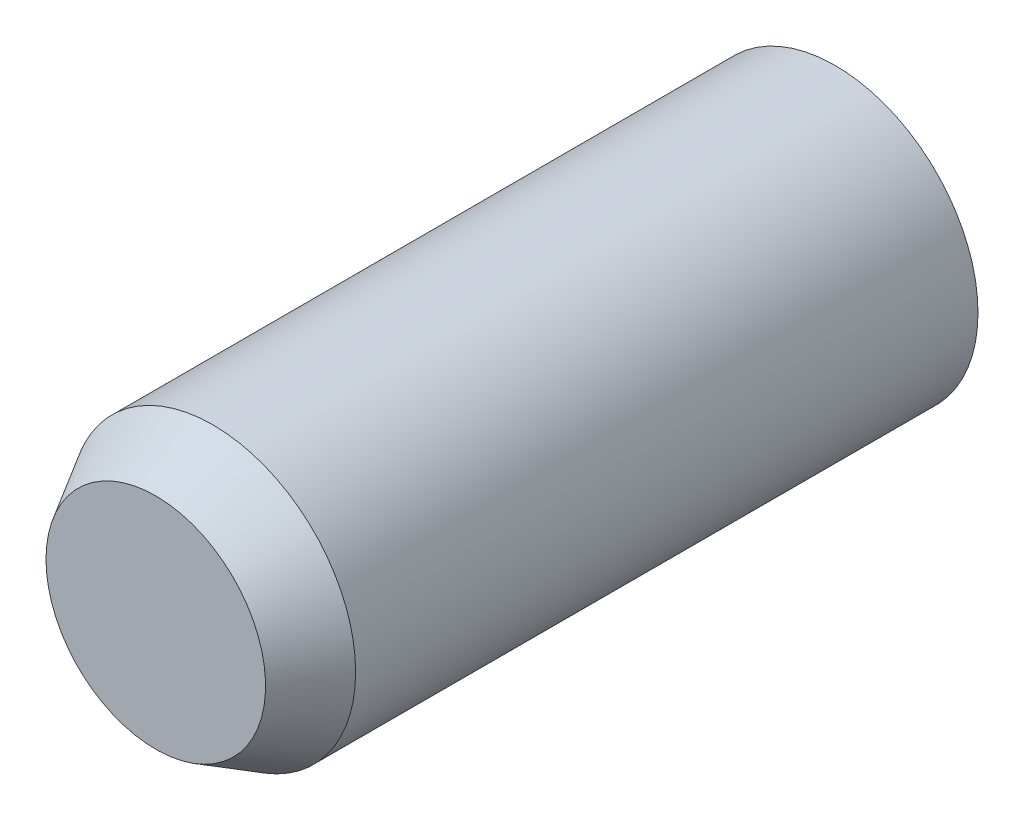
ISO-10303-21;
HEADER;
FILE_DESCRIPTION(('STEP AP214'),'2;1');
FILE_NAME('part.step','',(''),(''),'','','');
FILE_SCHEMA(('AUTOMOTIVE_DESIGN { 1 0 10303 214 1 1 1 1 }'));
ENDSEC;
DATA;
#1=APPLICATION_CONTEXT('core data for automotive mechanical design processes');
#2=APPLICATION_PROTOCOL_DEFINITION('international standard','automotive_design',2000,#1);
#3=PRODUCT_CONTEXT('',#1,'mechanical');
#4=PRODUCT('Part','Part','',(#3));
#5=PRODUCT_RELATED_PRODUCT_CATEGORY('part','',(#4));
#6=PRODUCT_DEFINITION_FORMATION('','',#4);
#7=PRODUCT_DEFINITION_CONTEXT('part definition',#1,'design');
#8=PRODUCT_DEFINITION('design','',#6,#7);
#9=PRODUCT_DEFINITION_SHAPE('','',#8);
#10=(LENGTH_UNIT() NAMED_UNIT(*) SI_UNIT(.MILLI.,.METRE.));
#11=(NAMED_UNIT(*) PLANE_ANGLE_UNIT() SI_UNIT($,.RADIAN.));
#12=(NAMED_UNIT(*) SI_UNIT($,.STERADIAN.) SOLID_ANGLE_UNIT());
#13=UNCERTAINTY_MEASURE_WITH_UNIT(LENGTH_MEASURE(1.E-05),#10,'distance_accuracy_value','');
#14=(GEOMETRIC_REPRESENTATION_CONTEXT(3) GLOBAL_UNCERTAINTY_ASSIGNED_CONTEXT((#13)) GLOBAL_UNIT_ASSIGNED_CONTEXT((#10,
#11,#12)) REPRESENTATION_CONTEXT('',''));
#15=CARTESIAN_POINT('',(0.,0.,0.));
#16=DIRECTION('',(0.,0.,1.));
#17=DIRECTION('',(1.,0.,0.));
#18=AXIS2_PLACEMENT_3D('',#15,#16,#17);
#19=CARTESIAN_POINT('',(226.285935164309,77.9472359217072,-1.1));
#20=DIRECTION('',(0.,0.,1.));
#21=DIRECTION('',(1.,0.,0.));
#22=AXIS2_PLACEMENT_3D('',#19,#20,#21);
#23=PLANE('',#22);
#24=CARTESIAN_POINT('',(226.285935164309,77.9472359217072,-1.09999999983756));
#25=DIRECTION('',(0.,0.,-1.));
#26=DIRECTION('',(-1.,0.,0.));
#27=AXIS2_PLACEMENT_3D('',#24,#25,#26);
#28=CIRCLE('',#27,1.92264973114202);
#29=CARTESIAN_POINT('',(224.363285433167,77.9472359217072,-1.09999999983756));
#30=VERTEX_POINT('',#29);
#31=EDGE_CURVE('E17',#30,#30,#28,.T.);
#32=ORIENTED_EDGE('',*,*,#31,.F.);
#33=EDGE_LOOP('',(#32));
#34=FACE_BOUND('',#33,.T.);
#35=ADVANCED_FACE('F14',(#34),#23,.T.);
#36=CARTESIAN_POINT('',(226.285935164309,77.9472359217072,-13.));
#37=DIRECTION('',(0.,0.,1.));
#38=DIRECTION('',(1.,0.,0.));
#39=AXIS2_PLACEMENT_3D('',#36,#37,#38);
#40=PLANE('',#39);
#41=CARTESIAN_POINT('',(226.285935164309,77.9472359217072,-13.));
#42=DIRECTION('',(0.,0.,1.));
#43=DIRECTION('',(1.,0.,0.));
#44=AXIS2_PLACEMENT_3D('',#41,#42,#43);
#45=CIRCLE('',#44,2.5);
#46=CARTESIAN_POINT('',(228.785935164309,77.9472359217072,-13.));
#47=VERTEX_POINT('',#46);
#48=EDGE_CURVE('E21',#47,#47,#45,.T.);
#49=ORIENTED_EDGE('',*,*,#48,.F.);
#50=EDGE_LOOP('',(#49));
#51=FACE_BOUND('',#50,.T.);
#52=ADVANCED_FACE('F37',(#51),#40,.F.);
#53=CARTESIAN_POINT('',(226.285935164309,77.9472359217072,-2.0999999999276));
#54=DIRECTION('',(0.,0.,-1.));
#55=DIRECTION('',(-1.,0.,0.));
#56=AXIS2_PLACEMENT_3D('',#53,#54,#55);
#57=CONICAL_SURFACE('',#56,2.49999999961048,0.523598775018433);
#58=ORIENTED_EDGE('',*,*,#31,.T.);
#59=EDGE_LOOP('',(#58));
#60=FACE_BOUND('',#59,.T.);
#61=CARTESIAN_POINT('',(226.285935164309,77.9472359217072,-2.1));
#62=DIRECTION('',(0.,0.,1.));
#63=DIRECTION('',(1.,0.,0.));
#64=AXIS2_PLACEMENT_3D('',#61,#62,#63);
#65=CIRCLE('',#64,2.5);
#66=CARTESIAN_POINT('',(228.785935164309,77.9472359217072,-2.1));
#67=VERTEX_POINT('',#66);
#68=EDGE_CURVE('E10',#67,#67,#65,.F.);
#69=ORIENTED_EDGE('',*,*,#68,.F.);
#70=EDGE_LOOP('',(#69));
#71=FACE_BOUND('',#70,.T.);
#72=ADVANCED_FACE('F33',(#60,#71),#57,.T.);
#73=CARTESIAN_POINT('',(226.285935164309,77.9472359217072,-13.3642619051657));
#74=DIRECTION('',(0.,0.,1.));
#75=DIRECTION('',(1.,0.,0.));
#76=AXIS2_PLACEMENT_3D('',#73,#74,#75);
#77=CYLINDRICAL_SURFACE('',#76,2.5);
#78=ORIENTED_EDGE('',*,*,#68,.T.);
#79=EDGE_LOOP('',(#78));
#80=FACE_BOUND('',#79,.T.);
#81=ORIENTED_EDGE('',*,*,#48,.T.);
#82=EDGE_LOOP('',(#81));
#83=FACE_BOUND('',#82,.T.);
#84=ADVANCED_FACE('F43',(#80,#83),#77,.T.);
#85=CLOSED_SHELL('',(#35,#52,#72,#84));
#86=MANIFOLD_SOLID_BREP('B1',#85);
#87=ADVANCED_BREP_SHAPE_REPRESENTATION('',(#18,#86),#14);
#88=SHAPE_DEFINITION_REPRESENTATION(#9,#87);
ENDSEC;
END-ISO-10303-21;
